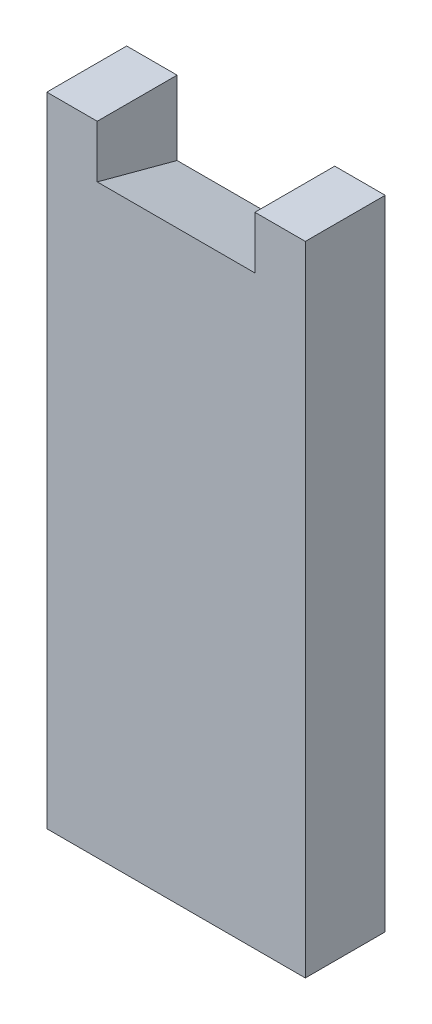
ISO-10303-21;
HEADER;
FILE_DESCRIPTION(('STEP AP214'),'2;1');
FILE_NAME('part.step','',(''),(''),'','','');
FILE_SCHEMA(('AUTOMOTIVE_DESIGN { 1 0 10303 214 1 1 1 1 }'));
ENDSEC;
DATA;
#1=APPLICATION_CONTEXT('core data for automotive mechanical design processes');
#2=APPLICATION_PROTOCOL_DEFINITION('international standard','automotive_design',2000,#1);
#3=PRODUCT_CONTEXT('',#1,'mechanical');
#4=PRODUCT('Part','Part','',(#3));
#5=PRODUCT_RELATED_PRODUCT_CATEGORY('part','',(#4));
#6=PRODUCT_DEFINITION_FORMATION('','',#4);
#7=PRODUCT_DEFINITION_CONTEXT('part definition',#1,'design');
#8=PRODUCT_DEFINITION('design','',#6,#7);
#9=PRODUCT_DEFINITION_SHAPE('','',#8);
#10=(LENGTH_UNIT() NAMED_UNIT(*) SI_UNIT(.MILLI.,.METRE.));
#11=(NAMED_UNIT(*) PLANE_ANGLE_UNIT() SI_UNIT($,.RADIAN.));
#12=(NAMED_UNIT(*) SI_UNIT($,.STERADIAN.) SOLID_ANGLE_UNIT());
#13=UNCERTAINTY_MEASURE_WITH_UNIT(LENGTH_MEASURE(1.E-05),#10,'distance_accuracy_value','');
#14=(GEOMETRIC_REPRESENTATION_CONTEXT(3) GLOBAL_UNCERTAINTY_ASSIGNED_CONTEXT((#13)) GLOBAL_UNIT_ASSIGNED_CONTEXT((#10,
#11,#12)) REPRESENTATION_CONTEXT('',''));
#15=CARTESIAN_POINT('',(0.,0.,0.));
#16=DIRECTION('',(0.,0.,1.));
#17=DIRECTION('',(1.,0.,0.));
#18=AXIS2_PLACEMENT_3D('',#15,#16,#17);
#19=CARTESIAN_POINT('',(0.,0.,7.6));
#20=DIRECTION('',(0.,1.,0.));
#21=DIRECTION('',(-1.,0.,0.));
#22=AXIS2_PLACEMENT_3D('',#19,#20,#21);
#23=PLANE('',#22);
#24=DIRECTION('',(1.,0.,0.));
#25=VECTOR('',#24,1.);
#26=CARTESIAN_POINT('',(0.,0.,0.));
#27=LINE('',#26,#25);
#28=CARTESIAN_POINT('',(19.8,0.,0.));
#29=VERTEX_POINT('',#28);
#30=CARTESIAN_POINT('',(24.6,0.,0.));
#31=VERTEX_POINT('',#30);
#32=EDGE_CURVE('E117',#29,#31,#27,.T.);
#33=ORIENTED_EDGE('',*,*,#32,.F.);
#34=DIRECTION('',(0.,0.,-1.));
#35=VECTOR('',#34,1.);
#36=CARTESIAN_POINT('',(19.8,0.,7.6));
#37=LINE('',#36,#35);
#38=CARTESIAN_POINT('',(19.8,0.,7.6));
#39=VERTEX_POINT('',#38);
#40=EDGE_CURVE('E11',#39,#29,#37,.T.);
#41=ORIENTED_EDGE('',*,*,#40,.F.);
#42=DIRECTION('',(1.,0.,0.));
#43=VECTOR('',#42,1.);
#44=CARTESIAN_POINT('',(0.,0.,7.6));
#45=LINE('',#44,#43);
#46=CARTESIAN_POINT('',(24.6,0.,7.6));
#47=VERTEX_POINT('',#46);
#48=EDGE_CURVE('E127',#39,#47,#45,.T.);
#49=ORIENTED_EDGE('',*,*,#48,.T.);
#50=DIRECTION('',(0.,0.,-1.));
#51=VECTOR('',#50,1.);
#52=CARTESIAN_POINT('',(24.6,0.,7.6));
#53=LINE('',#52,#51);
#54=EDGE_CURVE('E58',#47,#31,#53,.T.);
#55=ORIENTED_EDGE('',*,*,#54,.T.);
#56=EDGE_LOOP('',(#33,#41,#49,#55));
#57=FACE_BOUND('',#56,.T.);
#58=ADVANCED_FACE('F39',(#57),#23,.T.);
#59=CARTESIAN_POINT('',(19.8,0.,7.6));
#60=DIRECTION('',(1.,0.,0.));
#61=DIRECTION('',(0.,0.,-1.));
#62=AXIS2_PLACEMENT_3D('',#59,#60,#61);
#63=PLANE('',#62);
#64=DIRECTION('',(0.,-1.,0.));
#65=VECTOR('',#64,1.);
#66=CARTESIAN_POINT('',(19.8,0.,0.));
#67=LINE('',#66,#65);
#68=CARTESIAN_POINT('',(19.8,-7.03641386247654,0.));
#69=VERTEX_POINT('',#68);
#70=EDGE_CURVE('E107',#29,#69,#67,.T.);
#71=ORIENTED_EDGE('',*,*,#70,.T.);
#72=DIRECTION('',(0.,-0.258819045102521,-0.965925826289068));
#73=VECTOR('',#72,1.);
#74=CARTESIAN_POINT('',(19.8,-5.,7.6));
#75=LINE('',#74,#73);
#76=CARTESIAN_POINT('',(19.8,-5.,7.6));
#77=VERTEX_POINT('',#76);
#78=EDGE_CURVE('E49',#77,#69,#75,.T.);
#79=ORIENTED_EDGE('',*,*,#78,.F.);
#80=DIRECTION('',(0.,-1.,0.));
#81=VECTOR('',#80,1.);
#82=CARTESIAN_POINT('',(19.8,0.,7.6));
#83=LINE('',#82,#81);
#84=EDGE_CURVE('E155',#39,#77,#83,.T.);
#85=ORIENTED_EDGE('',*,*,#84,.F.);
#86=ORIENTED_EDGE('',*,*,#40,.T.);
#87=EDGE_LOOP('',(#71,#79,#85,#86));
#88=FACE_BOUND('',#87,.T.);
#89=ADVANCED_FACE('F164',(#88),#63,.F.);
#90=CARTESIAN_POINT('',(0.,-5.,7.6));
#91=DIRECTION('',(0.,0.965925826289068,-0.258819045102521));
#92=DIRECTION('',(0.,0.258819045102521,0.965925826289068));
#93=AXIS2_PLACEMENT_3D('',#90,#91,#92);
#94=PLANE('',#93);
#95=DIRECTION('',(1.,0.,0.));
#96=VECTOR('',#95,1.);
#97=CARTESIAN_POINT('',(0.,-7.03641386247654,0.));
#98=LINE('',#97,#96);
#99=CARTESIAN_POINT('',(4.8,-7.03641386247654,0.));
#100=VERTEX_POINT('',#99);
#101=EDGE_CURVE('E104',#100,#69,#98,.T.);
#102=ORIENTED_EDGE('',*,*,#101,.F.);
#103=DIRECTION('',(0.,-0.258819045102521,-0.965925826289068));
#104=VECTOR('',#103,1.);
#105=CARTESIAN_POINT('',(4.8,-5.,7.6));
#106=LINE('',#105,#104);
#107=CARTESIAN_POINT('',(4.8,-5.,7.6));
#108=VERTEX_POINT('',#107);
#109=EDGE_CURVE('E43',#108,#100,#106,.T.);
#110=ORIENTED_EDGE('',*,*,#109,.F.);
#111=DIRECTION('',(1.,0.,0.));
#112=VECTOR('',#111,1.);
#113=CARTESIAN_POINT('',(0.,-5.,7.6));
#114=LINE('',#113,#112);
#115=EDGE_CURVE('E151',#108,#77,#114,.T.);
#116=ORIENTED_EDGE('',*,*,#115,.T.);
#117=ORIENTED_EDGE('',*,*,#78,.T.);
#118=EDGE_LOOP('',(#102,#110,#116,#117));
#119=FACE_BOUND('',#118,.T.);
#120=ADVANCED_FACE('F41',(#119),#94,.T.);
#121=CARTESIAN_POINT('',(4.8,0.,7.6));
#122=DIRECTION('',(1.,0.,0.));
#123=DIRECTION('',(0.,1.,0.));
#124=AXIS2_PLACEMENT_3D('',#121,#122,#123);
#125=PLANE('',#124);
#126=DIRECTION('',(0.,-1.,0.));
#127=VECTOR('',#126,1.);
#128=CARTESIAN_POINT('',(4.8,0.,0.));
#129=LINE('',#128,#127);
#130=CARTESIAN_POINT('',(4.8,0.,0.));
#131=VERTEX_POINT('',#130);
#132=EDGE_CURVE('E96',#131,#100,#129,.T.);
#133=ORIENTED_EDGE('',*,*,#132,.F.);
#134=DIRECTION('',(0.,0.,-1.));
#135=VECTOR('',#134,1.);
#136=CARTESIAN_POINT('',(4.8,0.,7.6));
#137=LINE('',#136,#135);
#138=CARTESIAN_POINT('',(4.8,0.,7.6));
#139=VERTEX_POINT('',#138);
#140=EDGE_CURVE('E102',#139,#131,#137,.T.);
#141=ORIENTED_EDGE('',*,*,#140,.F.);
#142=DIRECTION('',(0.,-1.,0.));
#143=VECTOR('',#142,1.);
#144=CARTESIAN_POINT('',(4.8,0.,7.6));
#145=LINE('',#144,#143);
#146=EDGE_CURVE('E100',#139,#108,#145,.T.);
#147=ORIENTED_EDGE('',*,*,#146,.T.);
#148=ORIENTED_EDGE('',*,*,#109,.T.);
#149=EDGE_LOOP('',(#133,#141,#147,#148));
#150=FACE_BOUND('',#149,.T.);
#151=ADVANCED_FACE('F93',(#150),#125,.T.);
#152=CARTESIAN_POINT('',(0.,0.,0.));
#153=VERTEX_POINT('',#152);
#154=EDGE_CURVE('E113',#153,#131,#27,.T.);
#155=ORIENTED_EDGE('',*,*,#154,.F.);
#156=DIRECTION('',(0.,0.,-1.));
#157=VECTOR('',#156,1.);
#158=CARTESIAN_POINT('',(0.,0.,7.6));
#159=LINE('',#158,#157);
#160=CARTESIAN_POINT('',(0.,0.,7.6));
#161=VERTEX_POINT('',#160);
#162=EDGE_CURVE('E135',#161,#153,#159,.T.);
#163=ORIENTED_EDGE('',*,*,#162,.F.);
#164=EDGE_CURVE('E143',#161,#139,#45,.T.);
#165=ORIENTED_EDGE('',*,*,#164,.T.);
#166=ORIENTED_EDGE('',*,*,#140,.T.);
#167=EDGE_LOOP('',(#155,#163,#165,#166));
#168=FACE_BOUND('',#167,.T.);
#169=ADVANCED_FACE('F139',(#168),#23,.T.);
#170=CARTESIAN_POINT('',(0.,0.,7.6));
#171=DIRECTION('',(1.,0.,0.));
#172=DIRECTION('',(0.,1.,0.));
#173=AXIS2_PLACEMENT_3D('',#170,#171,#172);
#174=PLANE('',#173);
#175=DIRECTION('',(0.,-1.,0.));
#176=VECTOR('',#175,1.);
#177=CARTESIAN_POINT('',(0.,0.,0.));
#178=LINE('',#177,#176);
#179=CARTESIAN_POINT('',(0.,-60.7,0.));
#180=VERTEX_POINT('',#179);
#181=EDGE_CURVE('E115',#153,#180,#178,.T.);
#182=ORIENTED_EDGE('',*,*,#181,.T.);
#183=DIRECTION('',(0.,0.,-1.));
#184=VECTOR('',#183,1.);
#185=CARTESIAN_POINT('',(0.,-60.7,7.6));
#186=LINE('',#185,#184);
#187=CARTESIAN_POINT('',(0.,-60.7,7.6));
#188=VERTEX_POINT('',#187);
#189=EDGE_CURVE('E132',#188,#180,#186,.T.);
#190=ORIENTED_EDGE('',*,*,#189,.F.);
#191=DIRECTION('',(0.,-1.,0.));
#192=VECTOR('',#191,1.);
#193=CARTESIAN_POINT('',(0.,0.,7.6));
#194=LINE('',#193,#192);
#195=EDGE_CURVE('E153',#161,#188,#194,.T.);
#196=ORIENTED_EDGE('',*,*,#195,.F.);
#197=ORIENTED_EDGE('',*,*,#162,.T.);
#198=EDGE_LOOP('',(#182,#190,#196,#197));
#199=FACE_BOUND('',#198,.T.);
#200=ADVANCED_FACE('F178',(#199),#174,.F.);
#201=CARTESIAN_POINT('',(0.,-60.7,7.6));
#202=DIRECTION('',(0.,1.,0.));
#203=DIRECTION('',(0.,0.,1.));
#204=AXIS2_PLACEMENT_3D('',#201,#202,#203);
#205=PLANE('',#204);
#206=DIRECTION('',(1.,0.,0.));
#207=VECTOR('',#206,1.);
#208=CARTESIAN_POINT('',(0.,-60.7,0.));
#209=LINE('',#208,#207);
#210=CARTESIAN_POINT('',(24.6,-60.7,0.));
#211=VERTEX_POINT('',#210);
#212=EDGE_CURVE('E121',#180,#211,#209,.T.);
#213=ORIENTED_EDGE('',*,*,#212,.T.);
#214=DIRECTION('',(0.,0.,-1.));
#215=VECTOR('',#214,1.);
#216=CARTESIAN_POINT('',(24.6,-60.7,7.6));
#217=LINE('',#216,#215);
#218=CARTESIAN_POINT('',(24.6,-60.7,7.6));
#219=VERTEX_POINT('',#218);
#220=EDGE_CURVE('E129',#219,#211,#217,.T.);
#221=ORIENTED_EDGE('',*,*,#220,.F.);
#222=DIRECTION('',(1.,0.,0.));
#223=VECTOR('',#222,1.);
#224=CARTESIAN_POINT('',(0.,-60.7,7.6));
#225=LINE('',#224,#223);
#226=EDGE_CURVE('E160',#188,#219,#225,.T.);
#227=ORIENTED_EDGE('',*,*,#226,.F.);
#228=ORIENTED_EDGE('',*,*,#189,.T.);
#229=EDGE_LOOP('',(#213,#221,#227,#228));
#230=FACE_BOUND('',#229,.T.);
#231=ADVANCED_FACE('F175',(#230),#205,.F.);
#232=CARTESIAN_POINT('',(24.6,0.,7.6));
#233=DIRECTION('',(1.,0.,0.));
#234=DIRECTION('',(0.,1.,0.));
#235=AXIS2_PLACEMENT_3D('',#232,#233,#234);
#236=PLANE('',#235);
#237=DIRECTION('',(0.,-1.,0.));
#238=VECTOR('',#237,1.);
#239=CARTESIAN_POINT('',(24.6,0.,0.));
#240=LINE('',#239,#238);
#241=EDGE_CURVE('E124',#31,#211,#240,.T.);
#242=ORIENTED_EDGE('',*,*,#241,.F.);
#243=ORIENTED_EDGE('',*,*,#54,.F.);
#244=DIRECTION('',(0.,-1.,0.));
#245=VECTOR('',#244,1.);
#246=CARTESIAN_POINT('',(24.6,0.,7.6));
#247=LINE('',#246,#245);
#248=EDGE_CURVE('E130',#47,#219,#247,.T.);
#249=ORIENTED_EDGE('',*,*,#248,.T.);
#250=ORIENTED_EDGE('',*,*,#220,.T.);
#251=EDGE_LOOP('',(#242,#243,#249,#250));
#252=FACE_BOUND('',#251,.T.);
#253=ADVANCED_FACE('F172',(#252),#236,.T.);
#254=CARTESIAN_POINT('',(0.,0.,7.6));
#255=DIRECTION('',(0.,0.,1.));
#256=DIRECTION('',(1.,0.,0.));
#257=AXIS2_PLACEMENT_3D('',#254,#255,#256);
#258=PLANE('',#257);
#259=ORIENTED_EDGE('',*,*,#48,.F.);
#260=ORIENTED_EDGE('',*,*,#84,.T.);
#261=ORIENTED_EDGE('',*,*,#115,.F.);
#262=ORIENTED_EDGE('',*,*,#146,.F.);
#263=ORIENTED_EDGE('',*,*,#164,.F.);
#264=ORIENTED_EDGE('',*,*,#195,.T.);
#265=ORIENTED_EDGE('',*,*,#226,.T.);
#266=ORIENTED_EDGE('',*,*,#248,.F.);
#267=EDGE_LOOP('',(#259,#260,#261,#262,#263,#264,#265,#266));
#268=FACE_BOUND('',#267,.T.);
#269=ADVANCED_FACE('F148',(#268),#258,.T.);
#270=CARTESIAN_POINT('',(0.,0.,0.));
#271=DIRECTION('',(0.,0.,1.));
#272=DIRECTION('',(1.,0.,0.));
#273=AXIS2_PLACEMENT_3D('',#270,#271,#272);
#274=PLANE('',#273);
#275=ORIENTED_EDGE('',*,*,#32,.T.);
#276=ORIENTED_EDGE('',*,*,#241,.T.);
#277=ORIENTED_EDGE('',*,*,#212,.F.);
#278=ORIENTED_EDGE('',*,*,#181,.F.);
#279=ORIENTED_EDGE('',*,*,#154,.T.);
#280=ORIENTED_EDGE('',*,*,#132,.T.);
#281=ORIENTED_EDGE('',*,*,#101,.T.);
#282=ORIENTED_EDGE('',*,*,#70,.F.);
#283=EDGE_LOOP('',(#275,#276,#277,#278,#279,#280,#281,#282));
#284=FACE_BOUND('',#283,.T.);
#285=ADVANCED_FACE('F110',(#284),#274,.F.);
#286=CLOSED_SHELL('',(#58,#89,#120,#151,#169,#200,#231,#253,#269,#285));
#287=MANIFOLD_SOLID_BREP('B2',#286);
#288=ADVANCED_BREP_SHAPE_REPRESENTATION('',(#18,#287),#14);
#289=SHAPE_DEFINITION_REPRESENTATION(#9,#288);
ENDSEC;
END-ISO-10303-21;
